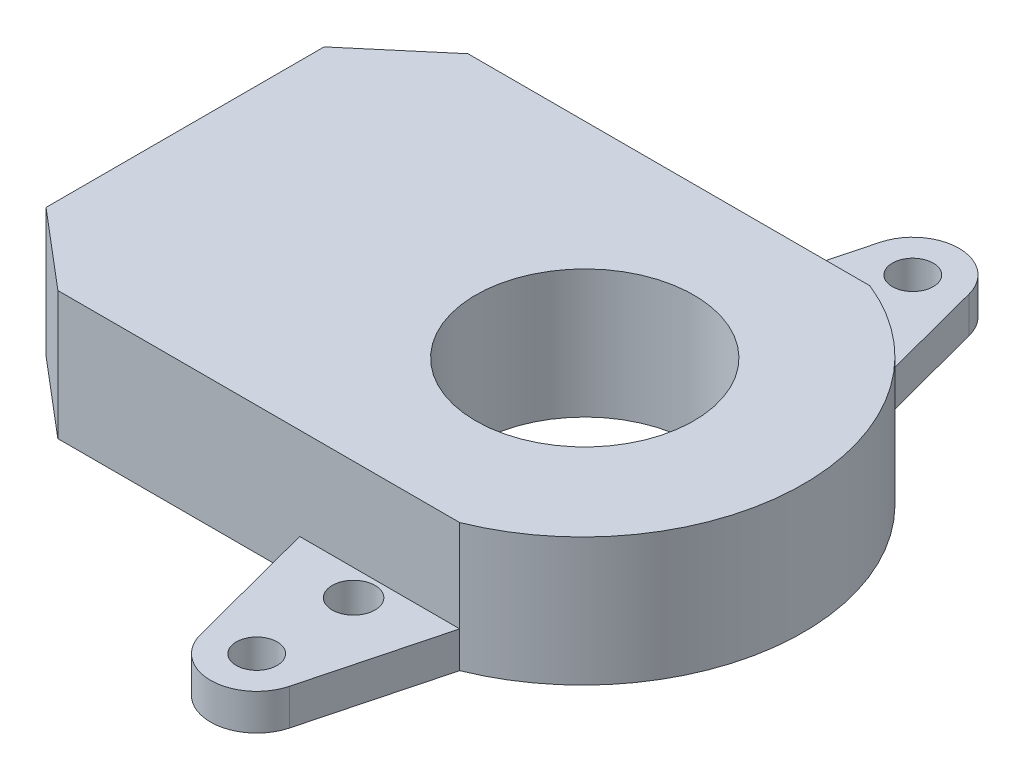
ISO-10303-21;
HEADER;
FILE_DESCRIPTION(('STEP AP214'),'2;1');
FILE_NAME('part.step','',(''),(''),'','','');
FILE_SCHEMA(('AUTOMOTIVE_DESIGN { 1 0 10303 214 1 1 1 1 }'));
ENDSEC;
DATA;
#1=APPLICATION_CONTEXT('core data for automotive mechanical design processes');
#2=APPLICATION_PROTOCOL_DEFINITION('international standard','automotive_design',2000,#1);
#3=PRODUCT_CONTEXT('',#1,'mechanical');
#4=PRODUCT('Part','Part','',(#3));
#5=PRODUCT_RELATED_PRODUCT_CATEGORY('part','',(#4));
#6=PRODUCT_DEFINITION_FORMATION('','',#4);
#7=PRODUCT_DEFINITION_CONTEXT('part definition',#1,'design');
#8=PRODUCT_DEFINITION('design','',#6,#7);
#9=PRODUCT_DEFINITION_SHAPE('','',#8);
#10=(LENGTH_UNIT() NAMED_UNIT(*) SI_UNIT(.MILLI.,.METRE.));
#11=(NAMED_UNIT(*) PLANE_ANGLE_UNIT() SI_UNIT($,.RADIAN.));
#12=(NAMED_UNIT(*) SI_UNIT($,.STERADIAN.) SOLID_ANGLE_UNIT());
#13=UNCERTAINTY_MEASURE_WITH_UNIT(LENGTH_MEASURE(1.E-05),#10,'distance_accuracy_value','');
#14=(GEOMETRIC_REPRESENTATION_CONTEXT(3) GLOBAL_UNCERTAINTY_ASSIGNED_CONTEXT((#13)) GLOBAL_UNIT_ASSIGNED_CONTEXT((#10,
#11,#12)) REPRESENTATION_CONTEXT('',''));
#15=CARTESIAN_POINT('',(0.,0.,0.));
#16=DIRECTION('',(0.,0.,1.));
#17=DIRECTION('',(1.,0.,0.));
#18=AXIS2_PLACEMENT_3D('',#15,#16,#17);
#19=CARTESIAN_POINT('',(5.4640495861586,9.,14.385));
#20=DIRECTION('',(0.,0.,-1.));
#21=DIRECTION('',(-1.,0.,0.));
#22=AXIS2_PLACEMENT_3D('',#19,#20,#21);
#23=PLANE('',#22);
#24=DIRECTION('',(0.,-1.,0.));
#25=VECTOR('',#24,1.);
#26=CARTESIAN_POINT('',(22.4274983759205,2.54,14.385));
#27=LINE('',#26,#25);
#28=CARTESIAN_POINT('',(22.4274983759205,2.54,14.385));
#29=VERTEX_POINT('',#28);
#30=CARTESIAN_POINT('',(22.4274983759205,0.,14.385));
#31=VERTEX_POINT('',#30);
#32=EDGE_CURVE('E178',#29,#31,#27,.T.);
#33=ORIENTED_EDGE('',*,*,#32,.F.);
#34=DIRECTION('',(-1.,0.,0.));
#35=VECTOR('',#34,1.);
#36=CARTESIAN_POINT('',(0.,2.54,14.385));
#37=LINE('',#36,#35);
#38=CARTESIAN_POINT('',(33.6525016240795,2.54,14.385));
#39=VERTEX_POINT('',#38);
#40=EDGE_CURVE('E50',#39,#29,#37,.T.);
#41=ORIENTED_EDGE('',*,*,#40,.F.);
#42=DIRECTION('',(0.,-1.,0.));
#43=VECTOR('',#42,1.);
#44=CARTESIAN_POINT('',(33.6525016240795,9.,14.385));
#45=LINE('',#44,#43);
#46=CARTESIAN_POINT('',(33.6525016240795,9.,14.385));
#47=VERTEX_POINT('',#46);
#48=EDGE_CURVE('E252',#47,#39,#45,.T.);
#49=ORIENTED_EDGE('',*,*,#48,.F.);
#50=DIRECTION('',(1.,0.,0.));
#51=VECTOR('',#50,1.);
#52=CARTESIAN_POINT('',(5.4640495861586,9.,14.385));
#53=LINE('',#52,#51);
#54=CARTESIAN_POINT('',(5.4640495861586,9.,14.385));
#55=VERTEX_POINT('',#54);
#56=EDGE_CURVE('E229',#55,#47,#53,.T.);
#57=ORIENTED_EDGE('',*,*,#56,.F.);
#58=DIRECTION('',(0.,-1.,0.));
#59=VECTOR('',#58,1.);
#60=CARTESIAN_POINT('',(5.4640495861586,9.,14.385));
#61=LINE('',#60,#59);
#62=CARTESIAN_POINT('',(5.4640495861586,0.,14.385));
#63=VERTEX_POINT('',#62);
#64=EDGE_CURVE('E254',#55,#63,#61,.T.);
#65=ORIENTED_EDGE('',*,*,#64,.T.);
#66=DIRECTION('',(1.,0.,0.));
#67=VECTOR('',#66,1.);
#68=CARTESIAN_POINT('',(5.4640495861586,0.,14.385));
#69=LINE('',#68,#67);
#70=EDGE_CURVE('E56',#63,#31,#69,.T.);
#71=ORIENTED_EDGE('',*,*,#70,.T.);
#72=EDGE_LOOP('',(#33,#41,#49,#57,#65,#71));
#73=FACE_BOUND('',#72,.T.);
#74=ADVANCED_FACE('F35',(#73),#23,.F.);
#75=CARTESIAN_POINT('',(5.4640495861586,9.,-14.385));
#76=DIRECTION('',(0.,0.,1.));
#77=DIRECTION('',(1.,0.,0.));
#78=AXIS2_PLACEMENT_3D('',#75,#76,#77);
#79=PLANE('',#78);
#80=DIRECTION('',(1.,0.,0.));
#81=VECTOR('',#80,1.);
#82=CARTESIAN_POINT('',(0.,2.54,-14.385));
#83=LINE('',#82,#81);
#84=CARTESIAN_POINT('',(22.4274983759205,2.54,-14.385));
#85=VERTEX_POINT('',#84);
#86=CARTESIAN_POINT('',(33.6525016240795,2.54,-14.385));
#87=VERTEX_POINT('',#86);
#88=EDGE_CURVE('E187',#85,#87,#83,.T.);
#89=ORIENTED_EDGE('',*,*,#88,.F.);
#90=DIRECTION('',(0.,-1.,0.));
#91=VECTOR('',#90,1.);
#92=CARTESIAN_POINT('',(22.4274983759205,2.54,-14.385));
#93=LINE('',#92,#91);
#94=CARTESIAN_POINT('',(22.4274983759205,0.,-14.385));
#95=VERTEX_POINT('',#94);
#96=EDGE_CURVE('E215',#85,#95,#93,.T.);
#97=ORIENTED_EDGE('',*,*,#96,.T.);
#98=DIRECTION('',(-1.,0.,0.));
#99=VECTOR('',#98,1.);
#100=CARTESIAN_POINT('',(5.4640495861586,0.,-14.385));
#101=LINE('',#100,#99);
#102=CARTESIAN_POINT('',(5.4640495861586,0.,-14.385));
#103=VERTEX_POINT('',#102);
#104=EDGE_CURVE('E225',#95,#103,#101,.T.);
#105=ORIENTED_EDGE('',*,*,#104,.T.);
#106=DIRECTION('',(0.,-1.,0.));
#107=VECTOR('',#106,1.);
#108=CARTESIAN_POINT('',(5.4640495861586,9.,-14.385));
#109=LINE('',#108,#107);
#110=CARTESIAN_POINT('',(5.4640495861586,9.,-14.385));
#111=VERTEX_POINT('',#110);
#112=EDGE_CURVE('E235',#111,#103,#109,.T.);
#113=ORIENTED_EDGE('',*,*,#112,.F.);
#114=DIRECTION('',(-1.,0.,0.));
#115=VECTOR('',#114,1.);
#116=CARTESIAN_POINT('',(5.4640495861586,9.,-14.385));
#117=LINE('',#116,#115);
#118=CARTESIAN_POINT('',(33.6525016240795,9.,-14.385));
#119=VERTEX_POINT('',#118);
#120=EDGE_CURVE('E233',#119,#111,#117,.T.);
#121=ORIENTED_EDGE('',*,*,#120,.F.);
#122=DIRECTION('',(0.,-1.,0.));
#123=VECTOR('',#122,1.);
#124=CARTESIAN_POINT('',(33.6525016240795,9.,-14.385));
#125=LINE('',#124,#123);
#126=EDGE_CURVE('E249',#119,#87,#125,.T.);
#127=ORIENTED_EDGE('',*,*,#126,.T.);
#128=EDGE_LOOP('',(#89,#97,#105,#113,#121,#127));
#129=FACE_BOUND('',#128,.T.);
#130=ADVANCED_FACE('F271',(#129),#79,.F.);
#131=CARTESIAN_POINT('',(0.,9.,-9.7536));
#132=DIRECTION('',(0.646590718713352,0.,0.762837100876557));
#133=DIRECTION('',(0.762837100876557,0.,-0.646590718713352));
#134=AXIS2_PLACEMENT_3D('',#131,#132,#133);
#135=PLANE('',#134);
#136=DIRECTION('',(-0.762837100876557,0.,0.646590718713352));
#137=VECTOR('',#136,1.);
#138=CARTESIAN_POINT('',(0.,0.,-9.7536));
#139=LINE('',#138,#137);
#140=CARTESIAN_POINT('',(0.,0.,-9.7536));
#141=VERTEX_POINT('',#140);
#142=EDGE_CURVE('E214',#103,#141,#139,.T.);
#143=ORIENTED_EDGE('',*,*,#142,.T.);
#144=DIRECTION('',(0.,-1.,0.));
#145=VECTOR('',#144,1.);
#146=CARTESIAN_POINT('',(0.,9.,-9.7536));
#147=LINE('',#146,#145);
#148=CARTESIAN_POINT('',(0.,9.,-9.7536));
#149=VERTEX_POINT('',#148);
#150=EDGE_CURVE('E11',#149,#141,#147,.T.);
#151=ORIENTED_EDGE('',*,*,#150,.F.);
#152=DIRECTION('',(-0.762837100876557,0.,0.646590718713352));
#153=VECTOR('',#152,1.);
#154=CARTESIAN_POINT('',(0.,9.,-9.7536));
#155=LINE('',#154,#153);
#156=EDGE_CURVE('E221',#111,#149,#155,.T.);
#157=ORIENTED_EDGE('',*,*,#156,.F.);
#158=ORIENTED_EDGE('',*,*,#112,.T.);
#159=EDGE_LOOP('',(#143,#151,#157,#158));
#160=FACE_BOUND('',#159,.T.);
#161=ADVANCED_FACE('F37',(#160),#135,.F.);
#162=CARTESIAN_POINT('',(0.,9.,9.7536));
#163=DIRECTION('',(1.,0.,0.));
#164=DIRECTION('',(0.,0.,-1.));
#165=AXIS2_PLACEMENT_3D('',#162,#163,#164);
#166=PLANE('',#165);
#167=DIRECTION('',(0.,0.,1.));
#168=VECTOR('',#167,1.);
#169=CARTESIAN_POINT('',(0.,0.,9.7536));
#170=LINE('',#169,#168);
#171=CARTESIAN_POINT('',(0.,0.,9.7536));
#172=VERTEX_POINT('',#171);
#173=EDGE_CURVE('E238',#141,#172,#170,.T.);
#174=ORIENTED_EDGE('',*,*,#173,.T.);
#175=DIRECTION('',(0.,-1.,0.));
#176=VECTOR('',#175,1.);
#177=CARTESIAN_POINT('',(0.,9.,9.7536));
#178=LINE('',#177,#176);
#179=CARTESIAN_POINT('',(0.,9.,9.7536));
#180=VERTEX_POINT('',#179);
#181=EDGE_CURVE('E43',#180,#172,#178,.T.);
#182=ORIENTED_EDGE('',*,*,#181,.F.);
#183=DIRECTION('',(0.,0.,1.));
#184=VECTOR('',#183,1.);
#185=CARTESIAN_POINT('',(0.,9.,9.7536));
#186=LINE('',#185,#184);
#187=EDGE_CURVE('E224',#149,#180,#186,.T.);
#188=ORIENTED_EDGE('',*,*,#187,.F.);
#189=ORIENTED_EDGE('',*,*,#150,.T.);
#190=EDGE_LOOP('',(#174,#182,#188,#189));
#191=FACE_BOUND('',#190,.T.);
#192=ADVANCED_FACE('F283',(#191),#166,.F.);
#193=CARTESIAN_POINT('',(0.,9.,9.7536));
#194=DIRECTION('',(0.646590718713352,0.,-0.762837100876557));
#195=DIRECTION('',(-0.762837100876557,0.,-0.646590718713352));
#196=AXIS2_PLACEMENT_3D('',#193,#194,#195);
#197=PLANE('',#196);
#198=DIRECTION('',(0.762837100876557,0.,0.646590718713352));
#199=VECTOR('',#198,1.);
#200=CARTESIAN_POINT('',(0.,0.,9.7536));
#201=LINE('',#200,#199);
#202=EDGE_CURVE('E240',#172,#63,#201,.T.);
#203=ORIENTED_EDGE('',*,*,#202,.T.);
#204=ORIENTED_EDGE('',*,*,#64,.F.);
#205=DIRECTION('',(0.762837100876557,0.,0.646590718713352));
#206=VECTOR('',#205,1.);
#207=CARTESIAN_POINT('',(0.,9.,9.7536));
#208=LINE('',#207,#206);
#209=EDGE_CURVE('E227',#180,#55,#208,.T.);
#210=ORIENTED_EDGE('',*,*,#209,.F.);
#211=ORIENTED_EDGE('',*,*,#181,.T.);
#212=EDGE_LOOP('',(#203,#204,#210,#211));
#213=FACE_BOUND('',#212,.T.);
#214=ADVANCED_FACE('F260',(#213),#197,.F.);
#215=CARTESIAN_POINT('',(27.88,9.,0.));
#216=DIRECTION('',(0.,-1.,0.));
#217=DIRECTION('',(0.,0.,-1.));
#218=AXIS2_PLACEMENT_3D('',#215,#216,#217);
#219=CYLINDRICAL_SURFACE('',#218,15.5);
#220=CARTESIAN_POINT('',(27.88,0.,0.));
#221=DIRECTION('',(0.,1.,0.));
#222=DIRECTION('',(0.,0.,-1.));
#223=AXIS2_PLACEMENT_3D('',#220,#221,#222);
#224=CIRCLE('',#223,15.5);
#225=CARTESIAN_POINT('',(33.6525016240795,0.,14.385));
#226=VERTEX_POINT('',#225);
#227=CARTESIAN_POINT('',(33.6525016240795,0.,-14.385));
#228=VERTEX_POINT('',#227);
#229=EDGE_CURVE('E243',#226,#228,#224,.T.);
#230=ORIENTED_EDGE('',*,*,#229,.T.);
#231=DIRECTION('',(0.,-1.,0.));
#232=VECTOR('',#231,1.);
#233=CARTESIAN_POINT('',(33.6525016240795,2.54,-14.385));
#234=LINE('',#233,#232);
#235=EDGE_CURVE('E218',#87,#228,#234,.T.);
#236=ORIENTED_EDGE('',*,*,#235,.F.);
#237=ORIENTED_EDGE('',*,*,#126,.F.);
#238=CARTESIAN_POINT('',(27.88,9.,0.));
#239=DIRECTION('',(0.,1.,0.));
#240=DIRECTION('',(0.,0.,1.));
#241=AXIS2_PLACEMENT_3D('',#238,#239,#240);
#242=CIRCLE('',#241,15.5);
#243=EDGE_CURVE('E231',#47,#119,#242,.T.);
#244=ORIENTED_EDGE('',*,*,#243,.F.);
#245=ORIENTED_EDGE('',*,*,#48,.T.);
#246=DIRECTION('',(0.,-1.,0.));
#247=VECTOR('',#246,1.);
#248=CARTESIAN_POINT('',(33.6525016240795,2.54,14.385));
#249=LINE('',#248,#247);
#250=EDGE_CURVE('E153',#39,#226,#249,.T.);
#251=ORIENTED_EDGE('',*,*,#250,.T.);
#252=EDGE_LOOP('',(#230,#236,#237,#244,#245,#251));
#253=FACE_BOUND('',#252,.T.);
#254=ADVANCED_FACE('F281',(#253),#219,.T.);
#255=CARTESIAN_POINT('',(27.88,9.,0.));
#256=DIRECTION('',(0.,-1.,0.));
#257=DIRECTION('',(0.,0.,-1.));
#258=AXIS2_PLACEMENT_3D('',#255,#256,#257);
#259=PLANE('',#258);
#260=CARTESIAN_POINT('',(28.04,9.,0.));
#261=DIRECTION('',(0.,1.,0.));
#262=DIRECTION('',(0.,0.,1.));
#263=AXIS2_PLACEMENT_3D('',#260,#261,#262);
#264=CIRCLE('',#263,7.65);
#265=CARTESIAN_POINT('',(28.04,9.,7.65));
#266=VERTEX_POINT('',#265);
#267=EDGE_CURVE('E373',#266,#266,#264,.T.);
#268=ORIENTED_EDGE('',*,*,#267,.F.);
#269=EDGE_LOOP('',(#268));
#270=FACE_BOUND('',#269,.T.);
#271=ORIENTED_EDGE('',*,*,#156,.T.);
#272=ORIENTED_EDGE('',*,*,#187,.T.);
#273=ORIENTED_EDGE('',*,*,#209,.T.);
#274=ORIENTED_EDGE('',*,*,#56,.T.);
#275=ORIENTED_EDGE('',*,*,#243,.T.);
#276=ORIENTED_EDGE('',*,*,#120,.T.);
#277=EDGE_LOOP('',(#271,#272,#273,#274,#275,#276));
#278=FACE_BOUND('',#277,.T.);
#279=ADVANCED_FACE('F316',(#270,#278),#259,.F.);
#280=CARTESIAN_POINT('',(27.88,0.,0.));
#281=DIRECTION('',(0.,-1.,0.));
#282=DIRECTION('',(0.,0.,-1.));
#283=AXIS2_PLACEMENT_3D('',#280,#281,#282);
#284=PLANE('',#283);
#285=CARTESIAN_POINT('',(28.04,0.,0.));
#286=DIRECTION('',(0.,1.,0.));
#287=DIRECTION('',(0.,0.,1.));
#288=AXIS2_PLACEMENT_3D('',#285,#286,#287);
#289=CIRCLE('',#288,7.65);
#290=CARTESIAN_POINT('',(28.04,0.,7.65));
#291=VERTEX_POINT('',#290);
#292=EDGE_CURVE('E167',#291,#291,#289,.T.);
#293=ORIENTED_EDGE('',*,*,#292,.T.);
#294=EDGE_LOOP('',(#293));
#295=FACE_BOUND('',#294,.T.);
#296=ORIENTED_EDGE('',*,*,#142,.F.);
#297=ORIENTED_EDGE('',*,*,#104,.F.);
#298=DIRECTION('',(0.253955475555716,0.,-0.967215909937006));
#299=VECTOR('',#298,1.);
#300=CARTESIAN_POINT('',(17.4476887876378,0.,4.58112408810694));
#301=LINE('',#300,#299);
#302=CARTESIAN_POINT('',(24.9086384915789,0.,-23.8346808521116));
#303=VERTEX_POINT('',#302);
#304=EDGE_CURVE('E204',#95,#303,#301,.T.);
#305=ORIENTED_EDGE('',*,*,#304,.T.);
#306=CARTESIAN_POINT('',(28.04,0.,-23.0125));
#307=DIRECTION('',(0.,-1.,0.));
#308=DIRECTION('',(0.,0.,-1.));
#309=AXIS2_PLACEMENT_3D('',#306,#307,#308);
#310=CIRCLE('',#309,3.2375);
#311=CARTESIAN_POINT('',(31.1713615084211,0.,-23.8346808521116));
#312=VERTEX_POINT('',#311);
#313=EDGE_CURVE('E177',#312,#303,#310,.F.);
#314=ORIENTED_EDGE('',*,*,#313,.F.);
#315=DIRECTION('',(0.253955475555717,0.,0.967215909937006));
#316=VECTOR('',#315,1.);
#317=CARTESIAN_POINT('',(35.0155222620522,0.,-9.19379377089691));
#318=LINE('',#317,#316);
#319=EDGE_CURVE('E201',#312,#228,#318,.T.);
#320=ORIENTED_EDGE('',*,*,#319,.T.);
#321=ORIENTED_EDGE('',*,*,#229,.F.);
#322=DIRECTION('',(-0.253955475555717,0.,0.967215909937006));
#323=VECTOR('',#322,1.);
#324=CARTESIAN_POINT('',(35.0155222620522,0.,9.19379377089694));
#325=LINE('',#324,#323);
#326=CARTESIAN_POINT('',(31.1713615084211,0.,23.8346808521116));
#327=VERTEX_POINT('',#326);
#328=EDGE_CURVE('E170',#226,#327,#325,.T.);
#329=ORIENTED_EDGE('',*,*,#328,.T.);
#330=CARTESIAN_POINT('',(28.04,0.,23.0125));
#331=DIRECTION('',(0.,-1.,0.));
#332=DIRECTION('',(0.,0.,-1.));
#333=AXIS2_PLACEMENT_3D('',#330,#331,#332);
#334=CIRCLE('',#333,3.2375);
#335=CARTESIAN_POINT('',(24.9086384915789,0.,23.8346808521116));
#336=VERTEX_POINT('',#335);
#337=EDGE_CURVE('E136',#327,#336,#334,.T.);
#338=ORIENTED_EDGE('',*,*,#337,.T.);
#339=DIRECTION('',(-0.253955475555716,0.,-0.967215909937006));
#340=VECTOR('',#339,1.);
#341=CARTESIAN_POINT('',(17.4476887876378,0.,-4.58112408810694));
#342=LINE('',#341,#340);
#343=EDGE_CURVE('E173',#336,#31,#342,.T.);
#344=ORIENTED_EDGE('',*,*,#343,.T.);
#345=ORIENTED_EDGE('',*,*,#70,.F.);
#346=ORIENTED_EDGE('',*,*,#202,.F.);
#347=ORIENTED_EDGE('',*,*,#173,.F.);
#348=EDGE_LOOP('',(#296,#297,#305,#314,#320,#321,#329,#338,#344,#345,#346,#347));
#349=FACE_BOUND('',#348,.T.);
#350=CARTESIAN_POINT('',(28.04,0.,-16.215));
#351=DIRECTION('',(0.,-1.,0.));
#352=DIRECTION('',(0.,0.,-1.));
#353=AXIS2_PLACEMENT_3D('',#350,#351,#352);
#354=CIRCLE('',#353,1.5);
#355=CARTESIAN_POINT('',(28.04,0.,-17.715));
#356=VERTEX_POINT('',#355);
#357=EDGE_CURVE('E207',#356,#356,#354,.F.);
#358=ORIENTED_EDGE('',*,*,#357,.T.);
#359=EDGE_LOOP('',(#358));
#360=FACE_BOUND('',#359,.T.);
#361=CARTESIAN_POINT('',(28.04,0.,-23.0125));
#362=DIRECTION('',(0.,-1.,0.));
#363=DIRECTION('',(0.,0.,-1.));
#364=AXIS2_PLACEMENT_3D('',#361,#362,#363);
#365=CIRCLE('',#364,1.435);
#366=CARTESIAN_POINT('',(28.04,0.,-24.4475));
#367=VERTEX_POINT('',#366);
#368=EDGE_CURVE('E184',#367,#367,#365,.F.);
#369=ORIENTED_EDGE('',*,*,#368,.T.);
#370=EDGE_LOOP('',(#369));
#371=FACE_BOUND('',#370,.T.);
#372=CARTESIAN_POINT('',(28.04,0.,16.215));
#373=DIRECTION('',(0.,-1.,0.));
#374=DIRECTION('',(0.,0.,-1.));
#375=AXIS2_PLACEMENT_3D('',#372,#373,#374);
#376=CIRCLE('',#375,1.5);
#377=CARTESIAN_POINT('',(28.04,0.,14.715));
#378=VERTEX_POINT('',#377);
#379=EDGE_CURVE('E163',#378,#378,#376,.T.);
#380=ORIENTED_EDGE('',*,*,#379,.F.);
#381=EDGE_LOOP('',(#380));
#382=FACE_BOUND('',#381,.T.);
#383=CARTESIAN_POINT('',(28.04,0.,23.0125));
#384=DIRECTION('',(0.,-1.,0.));
#385=DIRECTION('',(0.,0.,-1.));
#386=AXIS2_PLACEMENT_3D('',#383,#384,#385);
#387=CIRCLE('',#386,1.435);
#388=CARTESIAN_POINT('',(28.04,0.,21.5775));
#389=VERTEX_POINT('',#388);
#390=EDGE_CURVE('E166',#389,#389,#387,.T.);
#391=ORIENTED_EDGE('',*,*,#390,.F.);
#392=EDGE_LOOP('',(#391));
#393=FACE_BOUND('',#392,.T.);
#394=ADVANCED_FACE('F265',(#295,#349,#360,#371,#382,#393),#284,.T.);
#395=CARTESIAN_POINT('',(28.04,2.54,-23.0125));
#396=DIRECTION('',(0.,-1.,0.));
#397=DIRECTION('',(0.,0.,-1.));
#398=AXIS2_PLACEMENT_3D('',#395,#396,#397);
#399=CYLINDRICAL_SURFACE('',#398,3.2375);
#400=ORIENTED_EDGE('',*,*,#313,.T.);
#401=DIRECTION('',(0.,-1.,0.));
#402=VECTOR('',#401,1.);
#403=CARTESIAN_POINT('',(24.9086384915789,2.54,-23.8346808521116));
#404=LINE('',#403,#402);
#405=CARTESIAN_POINT('',(24.9086384915789,2.54,-23.8346808521116));
#406=VERTEX_POINT('',#405);
#407=EDGE_CURVE('E212',#406,#303,#404,.T.);
#408=ORIENTED_EDGE('',*,*,#407,.F.);
#409=CARTESIAN_POINT('',(28.04,2.54,-23.0125));
#410=DIRECTION('',(0.,-1.,0.));
#411=DIRECTION('',(0.,0.,-1.));
#412=AXIS2_PLACEMENT_3D('',#409,#410,#411);
#413=CIRCLE('',#412,3.2375);
#414=CARTESIAN_POINT('',(31.1713615084211,2.54,-23.8346808521116));
#415=VERTEX_POINT('',#414);
#416=EDGE_CURVE('E181',#415,#406,#413,.F.);
#417=ORIENTED_EDGE('',*,*,#416,.F.);
#418=DIRECTION('',(0.,-1.,0.));
#419=VECTOR('',#418,1.);
#420=CARTESIAN_POINT('',(31.1713615084211,2.54,-23.8346808521116));
#421=LINE('',#420,#419);
#422=EDGE_CURVE('E198',#415,#312,#421,.T.);
#423=ORIENTED_EDGE('',*,*,#422,.T.);
#424=EDGE_LOOP('',(#400,#408,#417,#423));
#425=FACE_BOUND('',#424,.T.);
#426=ADVANCED_FACE('F306',(#425),#399,.T.);
#427=CARTESIAN_POINT('',(17.4476887876378,2.54,4.58112408810694));
#428=DIRECTION('',(-0.967215909937006,0.,-0.253955475555716));
#429=DIRECTION('',(-0.253955475555716,0.,0.967215909937006));
#430=AXIS2_PLACEMENT_3D('',#427,#428,#429);
#431=PLANE('',#430);
#432=ORIENTED_EDGE('',*,*,#304,.F.);
#433=ORIENTED_EDGE('',*,*,#96,.F.);
#434=DIRECTION('',(0.253955475555716,0.,-0.967215909937006));
#435=VECTOR('',#434,1.);
#436=CARTESIAN_POINT('',(17.4476887876378,2.54,4.58112408810694));
#437=LINE('',#436,#435);
#438=EDGE_CURVE('E189',#85,#406,#437,.T.);
#439=ORIENTED_EDGE('',*,*,#438,.T.);
#440=ORIENTED_EDGE('',*,*,#407,.T.);
#441=EDGE_LOOP('',(#432,#433,#439,#440));
#442=FACE_BOUND('',#441,.T.);
#443=ADVANCED_FACE('F298',(#442),#431,.T.);
#444=CARTESIAN_POINT('',(28.04,2.54,-16.215));
#445=DIRECTION('',(0.,-1.,0.));
#446=DIRECTION('',(0.,0.,-1.));
#447=AXIS2_PLACEMENT_3D('',#444,#445,#446);
#448=CYLINDRICAL_SURFACE('',#447,1.5);
#449=CARTESIAN_POINT('',(28.04,2.54,-16.215));
#450=DIRECTION('',(0.,-1.,0.));
#451=DIRECTION('',(0.,0.,-1.));
#452=AXIS2_PLACEMENT_3D('',#449,#450,#451);
#453=CIRCLE('',#452,1.5);
#454=CARTESIAN_POINT('',(28.04,2.54,-17.715));
#455=VERTEX_POINT('',#454);
#456=EDGE_CURVE('E192',#455,#455,#453,.F.);
#457=ORIENTED_EDGE('',*,*,#456,.T.);
#458=EDGE_LOOP('',(#457));
#459=FACE_BOUND('',#458,.T.);
#460=ORIENTED_EDGE('',*,*,#357,.F.);
#461=EDGE_LOOP('',(#460));
#462=FACE_BOUND('',#461,.T.);
#463=ADVANCED_FACE('F336',(#459,#462),#448,.F.);
#464=CARTESIAN_POINT('',(35.0155222620522,2.54,-9.19379377089691));
#465=DIRECTION('',(0.967215909937006,0.,-0.253955475555717));
#466=DIRECTION('',(-0.253955475555717,0.,-0.967215909937006));
#467=AXIS2_PLACEMENT_3D('',#464,#465,#466);
#468=PLANE('',#467);
#469=ORIENTED_EDGE('',*,*,#319,.F.);
#470=ORIENTED_EDGE('',*,*,#422,.F.);
#471=DIRECTION('',(0.253955475555717,0.,0.967215909937006));
#472=VECTOR('',#471,1.);
#473=CARTESIAN_POINT('',(35.0155222620522,2.54,-9.19379377089691));
#474=LINE('',#473,#472);
#475=EDGE_CURVE('E183',#415,#87,#474,.T.);
#476=ORIENTED_EDGE('',*,*,#475,.T.);
#477=ORIENTED_EDGE('',*,*,#235,.T.);
#478=EDGE_LOOP('',(#469,#470,#476,#477));
#479=FACE_BOUND('',#478,.T.);
#480=ADVANCED_FACE('F310',(#479),#468,.T.);
#481=CARTESIAN_POINT('',(28.04,2.54,-23.0125));
#482=DIRECTION('',(0.,-1.,0.));
#483=DIRECTION('',(0.,0.,-1.));
#484=AXIS2_PLACEMENT_3D('',#481,#482,#483);
#485=CYLINDRICAL_SURFACE('',#484,1.435);
#486=CARTESIAN_POINT('',(28.04,2.54,-23.0125));
#487=DIRECTION('',(0.,-1.,0.));
#488=DIRECTION('',(0.,0.,-1.));
#489=AXIS2_PLACEMENT_3D('',#486,#487,#488);
#490=CIRCLE('',#489,1.435);
#491=CARTESIAN_POINT('',(28.04,2.54,-24.4475));
#492=VERTEX_POINT('',#491);
#493=EDGE_CURVE('E195',#492,#492,#490,.F.);
#494=ORIENTED_EDGE('',*,*,#493,.T.);
#495=EDGE_LOOP('',(#494));
#496=FACE_BOUND('',#495,.T.);
#497=ORIENTED_EDGE('',*,*,#368,.F.);
#498=EDGE_LOOP('',(#497));
#499=FACE_BOUND('',#498,.T.);
#500=ADVANCED_FACE('F335',(#496,#499),#485,.F.);
#501=CARTESIAN_POINT('',(0.,2.54,0.));
#502=DIRECTION('',(0.,-1.,0.));
#503=DIRECTION('',(0.,0.,-1.));
#504=AXIS2_PLACEMENT_3D('',#501,#502,#503);
#505=PLANE('',#504);
#506=ORIENTED_EDGE('',*,*,#416,.T.);
#507=ORIENTED_EDGE('',*,*,#438,.F.);
#508=ORIENTED_EDGE('',*,*,#88,.T.);
#509=ORIENTED_EDGE('',*,*,#475,.F.);
#510=EDGE_LOOP('',(#506,#507,#508,#509));
#511=FACE_BOUND('',#510,.T.);
#512=ORIENTED_EDGE('',*,*,#456,.F.);
#513=EDGE_LOOP('',(#512));
#514=FACE_BOUND('',#513,.T.);
#515=ORIENTED_EDGE('',*,*,#493,.F.);
#516=EDGE_LOOP('',(#515));
#517=FACE_BOUND('',#516,.T.);
#518=ADVANCED_FACE('F300',(#511,#514,#517),#505,.F.);
#519=CARTESIAN_POINT('',(35.0155222620522,2.54,9.19379377089694));
#520=DIRECTION('',(0.967215909937006,0.,0.253955475555717));
#521=DIRECTION('',(0.253955475555717,0.,-0.967215909937006));
#522=AXIS2_PLACEMENT_3D('',#519,#520,#521);
#523=PLANE('',#522);
#524=ORIENTED_EDGE('',*,*,#328,.F.);
#525=ORIENTED_EDGE('',*,*,#250,.F.);
#526=DIRECTION('',(-0.253955475555717,0.,0.967215909937006));
#527=VECTOR('',#526,1.);
#528=CARTESIAN_POINT('',(35.0155222620522,2.54,9.19379377089694));
#529=LINE('',#528,#527);
#530=CARTESIAN_POINT('',(31.1713615084211,2.54,23.8346808521116));
#531=VERTEX_POINT('',#530);
#532=EDGE_CURVE('E147',#39,#531,#529,.T.);
#533=ORIENTED_EDGE('',*,*,#532,.T.);
#534=DIRECTION('',(0.,-1.,0.));
#535=VECTOR('',#534,1.);
#536=CARTESIAN_POINT('',(31.1713615084211,2.54,23.8346808521116));
#537=LINE('',#536,#535);
#538=EDGE_CURVE('E131',#531,#327,#537,.T.);
#539=ORIENTED_EDGE('',*,*,#538,.T.);
#540=EDGE_LOOP('',(#524,#525,#533,#539));
#541=FACE_BOUND('',#540,.T.);
#542=ADVANCED_FACE('F152',(#541),#523,.T.);
#543=CARTESIAN_POINT('',(17.4476887876378,2.54,-4.58112408810694));
#544=DIRECTION('',(-0.967215909937006,0.,0.253955475555716));
#545=DIRECTION('',(0.253955475555716,0.,0.967215909937006));
#546=AXIS2_PLACEMENT_3D('',#543,#544,#545);
#547=PLANE('',#546);
#548=ORIENTED_EDGE('',*,*,#343,.F.);
#549=DIRECTION('',(0.,-1.,0.));
#550=VECTOR('',#549,1.);
#551=CARTESIAN_POINT('',(24.9086384915789,2.54,23.8346808521116));
#552=LINE('',#551,#550);
#553=CARTESIAN_POINT('',(24.9086384915789,2.54,23.8346808521116));
#554=VERTEX_POINT('',#553);
#555=EDGE_CURVE('E141',#554,#336,#552,.T.);
#556=ORIENTED_EDGE('',*,*,#555,.F.);
#557=DIRECTION('',(-0.253955475555716,0.,-0.967215909937006));
#558=VECTOR('',#557,1.);
#559=CARTESIAN_POINT('',(17.4476887876378,2.54,-4.58112408810694));
#560=LINE('',#559,#558);
#561=EDGE_CURVE('E149',#554,#29,#560,.T.);
#562=ORIENTED_EDGE('',*,*,#561,.T.);
#563=ORIENTED_EDGE('',*,*,#32,.T.);
#564=EDGE_LOOP('',(#548,#556,#562,#563));
#565=FACE_BOUND('',#564,.T.);
#566=ADVANCED_FACE('F269',(#565),#547,.T.);
#567=CARTESIAN_POINT('',(28.04,2.54,23.0125));
#568=DIRECTION('',(0.,-1.,0.));
#569=DIRECTION('',(0.,0.,-1.));
#570=AXIS2_PLACEMENT_3D('',#567,#568,#569);
#571=CYLINDRICAL_SURFACE('',#570,1.435);
#572=CARTESIAN_POINT('',(28.04,2.54,23.0125));
#573=DIRECTION('',(0.,-1.,0.));
#574=DIRECTION('',(0.,0.,-1.));
#575=AXIS2_PLACEMENT_3D('',#572,#573,#574);
#576=CIRCLE('',#575,1.435);
#577=CARTESIAN_POINT('',(28.04,2.54,21.5775));
#578=VERTEX_POINT('',#577);
#579=EDGE_CURVE('E154',#578,#578,#576,.T.);
#580=ORIENTED_EDGE('',*,*,#579,.F.);
#581=EDGE_LOOP('',(#580));
#582=FACE_BOUND('',#581,.T.);
#583=ORIENTED_EDGE('',*,*,#390,.T.);
#584=EDGE_LOOP('',(#583));
#585=FACE_BOUND('',#584,.T.);
#586=ADVANCED_FACE('F350',(#582,#585),#571,.F.);
#587=CARTESIAN_POINT('',(28.04,2.54,16.215));
#588=DIRECTION('',(0.,-1.,0.));
#589=DIRECTION('',(0.,0.,-1.));
#590=AXIS2_PLACEMENT_3D('',#587,#588,#589);
#591=CYLINDRICAL_SURFACE('',#590,1.5);
#592=CARTESIAN_POINT('',(28.04,2.54,16.215));
#593=DIRECTION('',(0.,-1.,0.));
#594=DIRECTION('',(0.,0.,-1.));
#595=AXIS2_PLACEMENT_3D('',#592,#593,#594);
#596=CIRCLE('',#595,1.5);
#597=CARTESIAN_POINT('',(28.04,2.54,14.715));
#598=VERTEX_POINT('',#597);
#599=EDGE_CURVE('E157',#598,#598,#596,.T.);
#600=ORIENTED_EDGE('',*,*,#599,.F.);
#601=EDGE_LOOP('',(#600));
#602=FACE_BOUND('',#601,.T.);
#603=ORIENTED_EDGE('',*,*,#379,.T.);
#604=EDGE_LOOP('',(#603));
#605=FACE_BOUND('',#604,.T.);
#606=ADVANCED_FACE('F347',(#602,#605),#591,.F.);
#607=CARTESIAN_POINT('',(28.04,2.54,23.0125));
#608=DIRECTION('',(0.,-1.,0.));
#609=DIRECTION('',(0.,0.,-1.));
#610=AXIS2_PLACEMENT_3D('',#607,#608,#609);
#611=CYLINDRICAL_SURFACE('',#610,3.2375);
#612=ORIENTED_EDGE('',*,*,#337,.F.);
#613=ORIENTED_EDGE('',*,*,#538,.F.);
#614=CARTESIAN_POINT('',(28.04,2.54,23.0125));
#615=DIRECTION('',(0.,-1.,0.));
#616=DIRECTION('',(0.,0.,-1.));
#617=AXIS2_PLACEMENT_3D('',#614,#615,#616);
#618=CIRCLE('',#617,3.2375);
#619=EDGE_CURVE('E134',#531,#554,#618,.T.);
#620=ORIENTED_EDGE('',*,*,#619,.T.);
#621=ORIENTED_EDGE('',*,*,#555,.T.);
#622=EDGE_LOOP('',(#612,#613,#620,#621));
#623=FACE_BOUND('',#622,.T.);
#624=ADVANCED_FACE('F133',(#623),#611,.T.);
#625=CARTESIAN_POINT('',(0.,2.54,0.));
#626=DIRECTION('',(0.,-1.,0.));
#627=DIRECTION('',(0.,0.,-1.));
#628=AXIS2_PLACEMENT_3D('',#625,#626,#627);
#629=PLANE('',#628);
#630=ORIENTED_EDGE('',*,*,#599,.T.);
#631=EDGE_LOOP('',(#630));
#632=FACE_BOUND('',#631,.T.);
#633=ORIENTED_EDGE('',*,*,#579,.T.);
#634=EDGE_LOOP('',(#633));
#635=FACE_BOUND('',#634,.T.);
#636=ORIENTED_EDGE('',*,*,#532,.F.);
#637=ORIENTED_EDGE('',*,*,#40,.T.);
#638=ORIENTED_EDGE('',*,*,#561,.F.);
#639=ORIENTED_EDGE('',*,*,#619,.F.);
#640=EDGE_LOOP('',(#636,#637,#638,#639));
#641=FACE_BOUND('',#640,.T.);
#642=ADVANCED_FACE('F146',(#632,#635,#641),#629,.F.);
#643=CARTESIAN_POINT('',(28.04,0.,0.));
#644=DIRECTION('',(0.,1.,0.));
#645=DIRECTION('',(0.,0.,1.));
#646=AXIS2_PLACEMENT_3D('',#643,#644,#645);
#647=CYLINDRICAL_SURFACE('',#646,7.65);
#648=ORIENTED_EDGE('',*,*,#292,.F.);
#649=EDGE_LOOP('',(#648));
#650=FACE_BOUND('',#649,.T.);
#651=ORIENTED_EDGE('',*,*,#267,.T.);
#652=EDGE_LOOP('',(#651));
#653=FACE_BOUND('',#652,.T.);
#654=ADVANCED_FACE('F363',(#650,#653),#647,.F.);
#655=CLOSED_SHELL('',(#74,#130,#161,#192,#214,#254,#279,#394,#426,#443,#463,#480,#500,#518,#542,
#566,#586,#606,#624,#642,#654));
#656=MANIFOLD_SOLID_BREP('B2',#655);
#657=ADVANCED_BREP_SHAPE_REPRESENTATION('',(#18,#656),#14);
#658=SHAPE_DEFINITION_REPRESENTATION(#9,#657);
ENDSEC;
END-ISO-10303-21;
